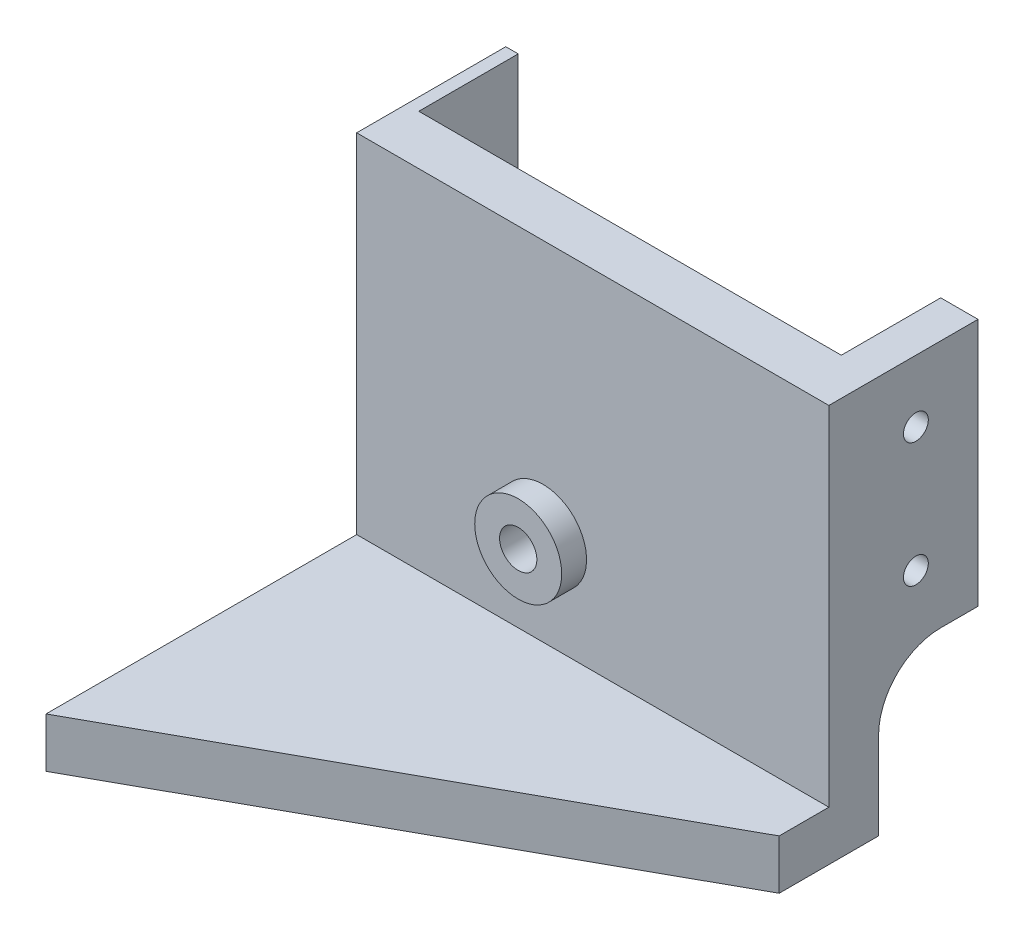
ISO-10303-21;
HEADER;
FILE_DESCRIPTION(('STEP AP214'),'2;1');
FILE_NAME('part.step','',(''),(''),'','','');
FILE_SCHEMA(('AUTOMOTIVE_DESIGN { 1 0 10303 214 1 1 1 1 }'));
ENDSEC;
DATA;
#1=APPLICATION_CONTEXT('core data for automotive mechanical design processes');
#2=APPLICATION_PROTOCOL_DEFINITION('international standard','automotive_design',2000,#1);
#3=PRODUCT_CONTEXT('',#1,'mechanical');
#4=PRODUCT('Part','Part','',(#3));
#5=PRODUCT_RELATED_PRODUCT_CATEGORY('part','',(#4));
#6=PRODUCT_DEFINITION_FORMATION('','',#4);
#7=PRODUCT_DEFINITION_CONTEXT('part definition',#1,'design');
#8=PRODUCT_DEFINITION('design','',#6,#7);
#9=PRODUCT_DEFINITION_SHAPE('','',#8);
#10=(LENGTH_UNIT() NAMED_UNIT(*) SI_UNIT(.MILLI.,.METRE.));
#11=(NAMED_UNIT(*) PLANE_ANGLE_UNIT() SI_UNIT($,.RADIAN.));
#12=(NAMED_UNIT(*) SI_UNIT($,.STERADIAN.) SOLID_ANGLE_UNIT());
#13=UNCERTAINTY_MEASURE_WITH_UNIT(LENGTH_MEASURE(1.E-05),#10,'distance_accuracy_value','');
#14=(GEOMETRIC_REPRESENTATION_CONTEXT(3) GLOBAL_UNCERTAINTY_ASSIGNED_CONTEXT((#13)) GLOBAL_UNIT_ASSIGNED_CONTEXT((#10,
#11,#12)) REPRESENTATION_CONTEXT('',''));
#15=CARTESIAN_POINT('',(0.,0.,0.));
#16=DIRECTION('',(0.,0.,1.));
#17=DIRECTION('',(1.,0.,0.));
#18=AXIS2_PLACEMENT_3D('',#15,#16,#17);
#19=CARTESIAN_POINT('',(0.,0.,0.));
#20=DIRECTION('',(0.,1.,0.));
#21=DIRECTION('',(0.,0.,1.));
#22=AXIS2_PLACEMENT_3D('',#19,#20,#21);
#23=PLANE('',#22);
#24=DIRECTION('',(0.,0.,1.));
#25=VECTOR('',#24,1.);
#26=CARTESIAN_POINT('',(1.,0.,0.));
#27=LINE('',#26,#25);
#28=CARTESIAN_POINT('',(1.,0.,-12.));
#29=VERTEX_POINT('',#28);
#30=CARTESIAN_POINT('',(1.,0.,-9.));
#31=VERTEX_POINT('',#30);
#32=EDGE_CURVE('E228',#29,#31,#27,.T.);
#33=ORIENTED_EDGE('',*,*,#32,.T.);
#34=DIRECTION('',(1.,0.,0.));
#35=VECTOR('',#34,1.);
#36=CARTESIAN_POINT('',(0.,0.,-9.));
#37=LINE('',#36,#35);
#38=CARTESIAN_POINT('',(0.,0.,-9.));
#39=VERTEX_POINT('',#38);
#40=EDGE_CURVE('E270',#31,#39,#37,.F.);
#41=ORIENTED_EDGE('',*,*,#40,.T.);
#42=DIRECTION('',(0.,0.,-1.));
#43=VECTOR('',#42,1.);
#44=CARTESIAN_POINT('',(0.,0.,0.));
#45=LINE('',#44,#43);
#46=CARTESIAN_POINT('',(0.,0.,-12.));
#47=VERTEX_POINT('',#46);
#48=EDGE_CURVE('E232',#39,#47,#45,.T.);
#49=ORIENTED_EDGE('',*,*,#48,.T.);
#50=DIRECTION('',(1.,0.,0.));
#51=VECTOR('',#50,1.);
#52=CARTESIAN_POINT('',(0.,0.,-12.));
#53=LINE('',#52,#51);
#54=EDGE_CURVE('E224',#47,#29,#53,.T.);
#55=ORIENTED_EDGE('',*,*,#54,.T.);
#56=EDGE_LOOP('',(#33,#41,#49,#55));
#57=FACE_BOUND('',#56,.T.);
#58=ADVANCED_FACE('F41',(#57),#23,.F.);
#59=DIRECTION('',(0.,0.,-1.));
#60=VECTOR('',#59,1.);
#61=CARTESIAN_POINT('',(38.,0.,0.));
#62=LINE('',#61,#60);
#63=CARTESIAN_POINT('',(38.,0.,-9.));
#64=VERTEX_POINT('',#63);
#65=CARTESIAN_POINT('',(38.,0.,-12.));
#66=VERTEX_POINT('',#65);
#67=EDGE_CURVE('E197',#64,#66,#62,.T.);
#68=ORIENTED_EDGE('',*,*,#67,.F.);
#69=DIRECTION('',(1.,0.,0.));
#70=VECTOR('',#69,1.);
#71=CARTESIAN_POINT('',(0.,0.,-9.));
#72=LINE('',#71,#70);
#73=CARTESIAN_POINT('',(35.,0.,-9.));
#74=VERTEX_POINT('',#73);
#75=EDGE_CURVE('E273',#64,#74,#72,.F.);
#76=ORIENTED_EDGE('',*,*,#75,.T.);
#77=DIRECTION('',(0.,0.,1.));
#78=VECTOR('',#77,1.);
#79=CARTESIAN_POINT('',(35.,0.,0.));
#80=LINE('',#79,#78);
#81=CARTESIAN_POINT('',(35.,0.,-12.));
#82=VERTEX_POINT('',#81);
#83=EDGE_CURVE('E223',#82,#74,#80,.T.);
#84=ORIENTED_EDGE('',*,*,#83,.F.);
#85=EDGE_CURVE('E191',#82,#66,#53,.T.);
#86=ORIENTED_EDGE('',*,*,#85,.T.);
#87=EDGE_LOOP('',(#68,#76,#84,#86));
#88=FACE_BOUND('',#87,.T.);
#89=ADVANCED_FACE('F336',(#88),#23,.F.);
#90=CARTESIAN_POINT('',(0.,20.,-12.));
#91=DIRECTION('',(0.,0.,-1.));
#92=DIRECTION('',(-1.,0.,0.));
#93=AXIS2_PLACEMENT_3D('',#90,#91,#92);
#94=PLANE('',#93);
#95=ORIENTED_EDGE('',*,*,#85,.F.);
#96=DIRECTION('',(0.,-1.,0.));
#97=VECTOR('',#96,1.);
#98=CARTESIAN_POINT('',(35.,20.,-12.));
#99=LINE('',#98,#97);
#100=CARTESIAN_POINT('',(35.,20.,-12.));
#101=VERTEX_POINT('',#100);
#102=EDGE_CURVE('E259',#101,#82,#99,.T.);
#103=ORIENTED_EDGE('',*,*,#102,.F.);
#104=DIRECTION('',(1.,0.,0.));
#105=VECTOR('',#104,1.);
#106=CARTESIAN_POINT('',(0.,20.,-12.));
#107=LINE('',#106,#105);
#108=CARTESIAN_POINT('',(38.,20.,-12.));
#109=VERTEX_POINT('',#108);
#110=EDGE_CURVE('E192',#101,#109,#107,.T.);
#111=ORIENTED_EDGE('',*,*,#110,.T.);
#112=DIRECTION('',(0.,-1.,0.));
#113=VECTOR('',#112,1.);
#114=CARTESIAN_POINT('',(38.,20.,-12.));
#115=LINE('',#114,#113);
#116=EDGE_CURVE('E219',#109,#66,#115,.T.);
#117=ORIENTED_EDGE('',*,*,#116,.T.);
#118=EDGE_LOOP('',(#95,#103,#111,#117));
#119=FACE_BOUND('',#118,.T.);
#120=ADVANCED_FACE('F334',(#119),#94,.T.);
#121=CARTESIAN_POINT('',(35.,20.,0.));
#122=DIRECTION('',(1.,0.,0.));
#123=DIRECTION('',(0.,0.,-1.));
#124=AXIS2_PLACEMENT_3D('',#121,#122,#123);
#125=PLANE('',#124);
#126=CARTESIAN_POINT('',(35.,15.,-7.));
#127=DIRECTION('',(1.,0.,0.));
#128=DIRECTION('',(0.,0.,-1.));
#129=AXIS2_PLACEMENT_3D('',#126,#127,#128);
#130=CIRCLE('',#129,1.);
#131=CARTESIAN_POINT('',(35.,15.,-8.));
#132=VERTEX_POINT('',#131);
#133=EDGE_CURVE('E158',#132,#132,#130,.T.);
#134=ORIENTED_EDGE('',*,*,#133,.T.);
#135=EDGE_LOOP('',(#134));
#136=FACE_BOUND('',#135,.T.);
#137=CARTESIAN_POINT('',(35.,5.,-7.));
#138=DIRECTION('',(1.,0.,0.));
#139=DIRECTION('',(0.,0.,-1.));
#140=AXIS2_PLACEMENT_3D('',#137,#138,#139);
#141=CIRCLE('',#140,1.);
#142=CARTESIAN_POINT('',(35.,5.,-8.));
#143=VERTEX_POINT('',#142);
#144=EDGE_CURVE('E448',#143,#143,#141,.T.);
#145=ORIENTED_EDGE('',*,*,#144,.T.);
#146=EDGE_LOOP('',(#145));
#147=FACE_BOUND('',#146,.T.);
#148=ORIENTED_EDGE('',*,*,#83,.T.);
#149=CARTESIAN_POINT('',(35.,-5.,-9.));
#150=DIRECTION('',(1.,0.,0.));
#151=DIRECTION('',(0.,0.,-1.));
#152=AXIS2_PLACEMENT_3D('',#149,#150,#151);
#153=CIRCLE('',#152,5.);
#154=CARTESIAN_POINT('',(35.,-5.,-4.));
#155=VERTEX_POINT('',#154);
#156=EDGE_CURVE('E50',#74,#155,#153,.T.);
#157=ORIENTED_EDGE('',*,*,#156,.T.);
#158=DIRECTION('',(0.,-1.,0.));
#159=VECTOR('',#158,1.);
#160=CARTESIAN_POINT('',(35.,20.,-4.));
#161=LINE('',#160,#159);
#162=CARTESIAN_POINT('',(35.,20.,-4.));
#163=VERTEX_POINT('',#162);
#164=EDGE_CURVE('E256',#163,#155,#161,.T.);
#165=ORIENTED_EDGE('',*,*,#164,.F.);
#166=DIRECTION('',(0.,0.,1.));
#167=VECTOR('',#166,1.);
#168=CARTESIAN_POINT('',(35.,20.,0.));
#169=LINE('',#168,#167);
#170=EDGE_CURVE('E196',#101,#163,#169,.T.);
#171=ORIENTED_EDGE('',*,*,#170,.F.);
#172=ORIENTED_EDGE('',*,*,#102,.T.);
#173=EDGE_LOOP('',(#148,#157,#165,#171,#172));
#174=FACE_BOUND('',#173,.T.);
#175=ADVANCED_FACE('F289',(#136,#147,#174),#125,.F.);
#176=CARTESIAN_POINT('',(0.,20.,-4.));
#177=DIRECTION('',(0.,0.,-1.));
#178=DIRECTION('',(-1.,0.,0.));
#179=AXIS2_PLACEMENT_3D('',#176,#177,#178);
#180=PLANE('',#179);
#181=CARTESIAN_POINT('',(15.,-0.5,-4.));
#182=DIRECTION('',(0.,0.,-1.));
#183=DIRECTION('',(-1.,0.,0.));
#184=AXIS2_PLACEMENT_3D('',#181,#182,#183);
#185=CIRCLE('',#184,1.5);
#186=CARTESIAN_POINT('',(13.5,-0.5,-4.));
#187=VERTEX_POINT('',#186);
#188=EDGE_CURVE('E425',#187,#187,#185,.T.);
#189=ORIENTED_EDGE('',*,*,#188,.F.);
#190=EDGE_LOOP('',(#189));
#191=FACE_BOUND('',#190,.T.);
#192=DIRECTION('',(0.,1.,0.));
#193=VECTOR('',#192,1.);
#194=CARTESIAN_POINT('',(0.,-12.,-4.));
#195=LINE('',#194,#193);
#196=CARTESIAN_POINT('',(0.,-12.,-4.));
#197=VERTEX_POINT('',#196);
#198=CARTESIAN_POINT('',(0.,-5.,-4.));
#199=VERTEX_POINT('',#198);
#200=EDGE_CURVE('E187',#197,#199,#195,.T.);
#201=ORIENTED_EDGE('',*,*,#200,.T.);
#202=DIRECTION('',(1.,0.,0.));
#203=VECTOR('',#202,1.);
#204=CARTESIAN_POINT('',(0.,-5.,-4.));
#205=LINE('',#204,#203);
#206=CARTESIAN_POINT('',(1.,-5.,-4.));
#207=VERTEX_POINT('',#206);
#208=EDGE_CURVE('E266',#199,#207,#205,.T.);
#209=ORIENTED_EDGE('',*,*,#208,.T.);
#210=DIRECTION('',(0.,-1.,0.));
#211=VECTOR('',#210,1.);
#212=CARTESIAN_POINT('',(1.,20.,-4.));
#213=LINE('',#212,#211);
#214=CARTESIAN_POINT('',(1.,20.,-4.));
#215=VERTEX_POINT('',#214);
#216=EDGE_CURVE('E253',#215,#207,#213,.T.);
#217=ORIENTED_EDGE('',*,*,#216,.F.);
#218=DIRECTION('',(1.,0.,0.));
#219=VECTOR('',#218,1.);
#220=CARTESIAN_POINT('',(0.,20.,-4.));
#221=LINE('',#220,#219);
#222=EDGE_CURVE('E201',#215,#163,#221,.T.);
#223=ORIENTED_EDGE('',*,*,#222,.T.);
#224=ORIENTED_EDGE('',*,*,#164,.T.);
#225=DIRECTION('',(1.,0.,0.));
#226=VECTOR('',#225,1.);
#227=CARTESIAN_POINT('',(0.,-5.,-4.));
#228=LINE('',#227,#226);
#229=CARTESIAN_POINT('',(38.,-5.,-4.));
#230=VERTEX_POINT('',#229);
#231=EDGE_CURVE('E262',#155,#230,#228,.T.);
#232=ORIENTED_EDGE('',*,*,#231,.T.);
#233=DIRECTION('',(0.,1.,0.));
#234=VECTOR('',#233,1.);
#235=CARTESIAN_POINT('',(38.,-12.,-4.));
#236=LINE('',#235,#234);
#237=CARTESIAN_POINT('',(38.,-12.,-4.));
#238=VERTEX_POINT('',#237);
#239=EDGE_CURVE('E184',#238,#230,#236,.T.);
#240=ORIENTED_EDGE('',*,*,#239,.F.);
#241=DIRECTION('',(1.,0.,0.));
#242=VECTOR('',#241,1.);
#243=CARTESIAN_POINT('',(0.,-12.,-4.));
#244=LINE('',#243,#242);
#245=EDGE_CURVE('E171',#197,#238,#244,.T.);
#246=ORIENTED_EDGE('',*,*,#245,.F.);
#247=EDGE_LOOP('',(#201,#209,#217,#223,#224,#232,#240,#246));
#248=FACE_BOUND('',#247,.T.);
#249=ADVANCED_FACE('F296',(#191,#248),#180,.T.);
#250=CARTESIAN_POINT('',(1.,20.,0.));
#251=DIRECTION('',(1.,0.,0.));
#252=DIRECTION('',(0.,0.,-1.));
#253=AXIS2_PLACEMENT_3D('',#250,#251,#252);
#254=PLANE('',#253);
#255=CARTESIAN_POINT('',(1.,15.,-7.));
#256=DIRECTION('',(1.,0.,0.));
#257=DIRECTION('',(0.,0.,-1.));
#258=AXIS2_PLACEMENT_3D('',#255,#256,#257);
#259=CIRCLE('',#258,1.);
#260=CARTESIAN_POINT('',(1.,15.,-8.));
#261=VERTEX_POINT('',#260);
#262=EDGE_CURVE('E416',#261,#261,#259,.T.);
#263=ORIENTED_EDGE('',*,*,#262,.F.);
#264=EDGE_LOOP('',(#263));
#265=FACE_BOUND('',#264,.T.);
#266=CARTESIAN_POINT('',(1.,5.,-7.));
#267=DIRECTION('',(1.,0.,0.));
#268=DIRECTION('',(0.,0.,-1.));
#269=AXIS2_PLACEMENT_3D('',#266,#267,#268);
#270=CIRCLE('',#269,1.);
#271=CARTESIAN_POINT('',(1.,5.,-8.));
#272=VERTEX_POINT('',#271);
#273=EDGE_CURVE('E452',#272,#272,#270,.T.);
#274=ORIENTED_EDGE('',*,*,#273,.F.);
#275=EDGE_LOOP('',(#274));
#276=FACE_BOUND('',#275,.T.);
#277=ORIENTED_EDGE('',*,*,#32,.F.);
#278=DIRECTION('',(0.,-1.,0.));
#279=VECTOR('',#278,1.);
#280=CARTESIAN_POINT('',(1.,20.,-12.));
#281=LINE('',#280,#279);
#282=CARTESIAN_POINT('',(1.,20.,-12.));
#283=VERTEX_POINT('',#282);
#284=EDGE_CURVE('E250',#283,#29,#281,.T.);
#285=ORIENTED_EDGE('',*,*,#284,.F.);
#286=DIRECTION('',(0.,0.,1.));
#287=VECTOR('',#286,1.);
#288=CARTESIAN_POINT('',(1.,20.,0.));
#289=LINE('',#288,#287);
#290=EDGE_CURVE('E205',#283,#215,#289,.T.);
#291=ORIENTED_EDGE('',*,*,#290,.T.);
#292=ORIENTED_EDGE('',*,*,#216,.T.);
#293=CARTESIAN_POINT('',(1.,-5.,-9.));
#294=DIRECTION('',(1.,0.,0.));
#295=DIRECTION('',(0.,0.,-1.));
#296=AXIS2_PLACEMENT_3D('',#293,#294,#295);
#297=CIRCLE('',#296,5.);
#298=EDGE_CURVE('E276',#207,#31,#297,.F.);
#299=ORIENTED_EDGE('',*,*,#298,.T.);
#300=EDGE_LOOP('',(#277,#285,#291,#292,#299));
#301=FACE_BOUND('',#300,.T.);
#302=ADVANCED_FACE('F310',(#265,#276,#301),#254,.T.);
#303=ORIENTED_EDGE('',*,*,#54,.F.);
#304=DIRECTION('',(0.,-1.,0.));
#305=VECTOR('',#304,1.);
#306=CARTESIAN_POINT('',(0.,20.,-12.));
#307=LINE('',#306,#305);
#308=CARTESIAN_POINT('',(0.,20.,-12.));
#309=VERTEX_POINT('',#308);
#310=EDGE_CURVE('E246',#309,#47,#307,.T.);
#311=ORIENTED_EDGE('',*,*,#310,.F.);
#312=EDGE_CURVE('E198',#309,#283,#107,.T.);
#313=ORIENTED_EDGE('',*,*,#312,.T.);
#314=ORIENTED_EDGE('',*,*,#284,.T.);
#315=EDGE_LOOP('',(#303,#311,#313,#314));
#316=FACE_BOUND('',#315,.T.);
#317=ADVANCED_FACE('F320',(#316),#94,.T.);
#318=CARTESIAN_POINT('',(0.,20.,0.));
#319=DIRECTION('',(-1.,0.,0.));
#320=DIRECTION('',(0.,0.,1.));
#321=AXIS2_PLACEMENT_3D('',#318,#319,#320);
#322=PLANE('',#321);
#323=CARTESIAN_POINT('',(0.,15.,-7.));
#324=DIRECTION('',(-1.,0.,0.));
#325=DIRECTION('',(0.,0.,1.));
#326=AXIS2_PLACEMENT_3D('',#323,#324,#325);
#327=CIRCLE('',#326,1.);
#328=CARTESIAN_POINT('',(0.,15.,-6.));
#329=VERTEX_POINT('',#328);
#330=EDGE_CURVE('E419',#329,#329,#327,.T.);
#331=ORIENTED_EDGE('',*,*,#330,.F.);
#332=EDGE_LOOP('',(#331));
#333=FACE_BOUND('',#332,.T.);
#334=CARTESIAN_POINT('',(0.,5.,-7.));
#335=DIRECTION('',(-1.,0.,0.));
#336=DIRECTION('',(0.,0.,1.));
#337=AXIS2_PLACEMENT_3D('',#334,#335,#336);
#338=CIRCLE('',#337,1.);
#339=CARTESIAN_POINT('',(0.,5.,-6.));
#340=VERTEX_POINT('',#339);
#341=EDGE_CURVE('E456',#340,#340,#338,.T.);
#342=ORIENTED_EDGE('',*,*,#341,.F.);
#343=EDGE_LOOP('',(#342));
#344=FACE_BOUND('',#343,.T.);
#345=ORIENTED_EDGE('',*,*,#48,.F.);
#346=CARTESIAN_POINT('',(0.,-5.,-9.));
#347=DIRECTION('',(-1.,0.,0.));
#348=DIRECTION('',(0.,0.,1.));
#349=AXIS2_PLACEMENT_3D('',#346,#347,#348);
#350=CIRCLE('',#349,5.);
#351=EDGE_CURVE('E279',#39,#199,#350,.F.);
#352=ORIENTED_EDGE('',*,*,#351,.T.);
#353=ORIENTED_EDGE('',*,*,#200,.F.);
#354=DIRECTION('',(0.,0.,-1.));
#355=VECTOR('',#354,1.);
#356=CARTESIAN_POINT('',(0.,-12.,0.));
#357=LINE('',#356,#355);
#358=CARTESIAN_POINT('',(0.,-12.,25.));
#359=VERTEX_POINT('',#358);
#360=EDGE_CURVE('E166',#359,#197,#357,.T.);
#361=ORIENTED_EDGE('',*,*,#360,.F.);
#362=DIRECTION('',(0.,1.,0.));
#363=VECTOR('',#362,1.);
#364=CARTESIAN_POINT('',(0.,-12.,25.));
#365=LINE('',#364,#363);
#366=CARTESIAN_POINT('',(0.,-8.,25.));
#367=VERTEX_POINT('',#366);
#368=EDGE_CURVE('E173',#359,#367,#365,.T.);
#369=ORIENTED_EDGE('',*,*,#368,.T.);
#370=DIRECTION('',(0.,0.,-1.));
#371=VECTOR('',#370,1.);
#372=CARTESIAN_POINT('',(0.,-8.,25.));
#373=LINE('',#372,#371);
#374=CARTESIAN_POINT('',(0.,-8.,0.));
#375=VERTEX_POINT('',#374);
#376=EDGE_CURVE('E155',#367,#375,#373,.T.);
#377=ORIENTED_EDGE('',*,*,#376,.T.);
#378=DIRECTION('',(0.,-1.,0.));
#379=VECTOR('',#378,1.);
#380=CARTESIAN_POINT('',(0.,20.,0.));
#381=LINE('',#380,#379);
#382=CARTESIAN_POINT('',(0.,20.,0.));
#383=VERTEX_POINT('',#382);
#384=EDGE_CURVE('E242',#383,#375,#381,.T.);
#385=ORIENTED_EDGE('',*,*,#384,.F.);
#386=DIRECTION('',(0.,0.,-1.));
#387=VECTOR('',#386,1.);
#388=CARTESIAN_POINT('',(0.,20.,0.));
#389=LINE('',#388,#387);
#390=EDGE_CURVE('E209',#383,#309,#389,.T.);
#391=ORIENTED_EDGE('',*,*,#390,.T.);
#392=ORIENTED_EDGE('',*,*,#310,.T.);
#393=EDGE_LOOP('',(#345,#352,#353,#361,#369,#377,#385,#391,#392));
#394=FACE_BOUND('',#393,.T.);
#395=ADVANCED_FACE('F327',(#333,#344,#394),#322,.T.);
#396=CARTESIAN_POINT('',(0.,20.,0.));
#397=DIRECTION('',(0.,0.,-1.));
#398=DIRECTION('',(-1.,0.,0.));
#399=AXIS2_PLACEMENT_3D('',#396,#397,#398);
#400=PLANE('',#399);
#401=CARTESIAN_POINT('',(15.,-0.5,0.));
#402=DIRECTION('',(0.,0.,-1.));
#403=DIRECTION('',(-1.,0.,0.));
#404=AXIS2_PLACEMENT_3D('',#401,#402,#403);
#405=CIRCLE('',#404,3.5);
#406=CARTESIAN_POINT('',(11.5,-0.5,0.));
#407=VERTEX_POINT('',#406);
#408=EDGE_CURVE('E11',#407,#407,#405,.F.);
#409=ORIENTED_EDGE('',*,*,#408,.F.);
#410=EDGE_LOOP('',(#409));
#411=FACE_BOUND('',#410,.T.);
#412=ORIENTED_EDGE('',*,*,#384,.T.);
#413=DIRECTION('',(1.,0.,0.));
#414=VECTOR('',#413,1.);
#415=CARTESIAN_POINT('',(0.,-8.,0.));
#416=LINE('',#415,#414);
#417=CARTESIAN_POINT('',(38.,-8.,0.));
#418=VERTEX_POINT('',#417);
#419=EDGE_CURVE('E176',#375,#418,#416,.T.);
#420=ORIENTED_EDGE('',*,*,#419,.T.);
#421=DIRECTION('',(0.,-1.,0.));
#422=VECTOR('',#421,1.);
#423=CARTESIAN_POINT('',(38.,20.,0.));
#424=LINE('',#423,#422);
#425=CARTESIAN_POINT('',(38.,20.,0.));
#426=VERTEX_POINT('',#425);
#427=EDGE_CURVE('E164',#426,#418,#424,.T.);
#428=ORIENTED_EDGE('',*,*,#427,.F.);
#429=DIRECTION('',(1.,0.,0.));
#430=VECTOR('',#429,1.);
#431=CARTESIAN_POINT('',(0.,20.,0.));
#432=LINE('',#431,#430);
#433=EDGE_CURVE('E213',#383,#426,#432,.T.);
#434=ORIENTED_EDGE('',*,*,#433,.F.);
#435=EDGE_LOOP('',(#412,#420,#428,#434));
#436=FACE_BOUND('',#435,.T.);
#437=ADVANCED_FACE('F330',(#411,#436),#400,.F.);
#438=CARTESIAN_POINT('',(38.,20.,0.));
#439=DIRECTION('',(-1.,0.,0.));
#440=DIRECTION('',(0.,0.,1.));
#441=AXIS2_PLACEMENT_3D('',#438,#439,#440);
#442=PLANE('',#441);
#443=CARTESIAN_POINT('',(38.,15.,-7.));
#444=DIRECTION('',(-1.,0.,0.));
#445=DIRECTION('',(0.,0.,1.));
#446=AXIS2_PLACEMENT_3D('',#443,#444,#445);
#447=CIRCLE('',#446,1.);
#448=CARTESIAN_POINT('',(38.,15.,-6.));
#449=VERTEX_POINT('',#448);
#450=EDGE_CURVE('E412',#449,#449,#447,.T.);
#451=ORIENTED_EDGE('',*,*,#450,.T.);
#452=EDGE_LOOP('',(#451));
#453=FACE_BOUND('',#452,.T.);
#454=CARTESIAN_POINT('',(38.,5.,-7.));
#455=DIRECTION('',(-1.,0.,0.));
#456=DIRECTION('',(0.,0.,1.));
#457=AXIS2_PLACEMENT_3D('',#454,#455,#456);
#458=CIRCLE('',#457,1.);
#459=CARTESIAN_POINT('',(38.,5.,-6.));
#460=VERTEX_POINT('',#459);
#461=EDGE_CURVE('E460',#460,#460,#458,.T.);
#462=ORIENTED_EDGE('',*,*,#461,.T.);
#463=EDGE_LOOP('',(#462));
#464=FACE_BOUND('',#463,.T.);
#465=DIRECTION('',(0.,0.,-1.));
#466=VECTOR('',#465,1.);
#467=CARTESIAN_POINT('',(38.,-8.,25.));
#468=LINE('',#467,#466);
#469=CARTESIAN_POINT('',(38.,-8.,4.));
#470=VERTEX_POINT('',#469);
#471=EDGE_CURVE('E57',#470,#418,#468,.T.);
#472=ORIENTED_EDGE('',*,*,#471,.F.);
#473=DIRECTION('',(0.,1.,0.));
#474=VECTOR('',#473,1.);
#475=CARTESIAN_POINT('',(38.,-18.,4.));
#476=LINE('',#475,#474);
#477=CARTESIAN_POINT('',(38.,-12.,4.));
#478=VERTEX_POINT('',#477);
#479=EDGE_CURVE('E144',#478,#470,#476,.T.);
#480=ORIENTED_EDGE('',*,*,#479,.F.);
#481=DIRECTION('',(0.,0.,1.));
#482=VECTOR('',#481,1.);
#483=CARTESIAN_POINT('',(38.,-12.,0.));
#484=LINE('',#483,#482);
#485=EDGE_CURVE('E181',#238,#478,#484,.T.);
#486=ORIENTED_EDGE('',*,*,#485,.F.);
#487=ORIENTED_EDGE('',*,*,#239,.T.);
#488=CARTESIAN_POINT('',(38.,-5.,-9.));
#489=DIRECTION('',(-1.,0.,0.));
#490=DIRECTION('',(0.,0.,1.));
#491=AXIS2_PLACEMENT_3D('',#488,#489,#490);
#492=CIRCLE('',#491,5.);
#493=EDGE_CURVE('E65',#230,#64,#492,.T.);
#494=ORIENTED_EDGE('',*,*,#493,.T.);
#495=ORIENTED_EDGE('',*,*,#67,.T.);
#496=ORIENTED_EDGE('',*,*,#116,.F.);
#497=DIRECTION('',(0.,0.,-1.));
#498=VECTOR('',#497,1.);
#499=CARTESIAN_POINT('',(38.,20.,0.));
#500=LINE('',#499,#498);
#501=EDGE_CURVE('E216',#426,#109,#500,.T.);
#502=ORIENTED_EDGE('',*,*,#501,.F.);
#503=ORIENTED_EDGE('',*,*,#427,.T.);
#504=EDGE_LOOP('',(#472,#480,#486,#487,#494,#495,#496,#502,#503));
#505=FACE_BOUND('',#504,.T.);
#506=ADVANCED_FACE('F161',(#453,#464,#505),#442,.F.);
#507=CARTESIAN_POINT('',(0.,20.,0.));
#508=DIRECTION('',(0.,1.,0.));
#509=DIRECTION('',(0.,0.,1.));
#510=AXIS2_PLACEMENT_3D('',#507,#508,#509);
#511=PLANE('',#510);
#512=ORIENTED_EDGE('',*,*,#110,.F.);
#513=ORIENTED_EDGE('',*,*,#170,.T.);
#514=ORIENTED_EDGE('',*,*,#222,.F.);
#515=ORIENTED_EDGE('',*,*,#290,.F.);
#516=ORIENTED_EDGE('',*,*,#312,.F.);
#517=ORIENTED_EDGE('',*,*,#390,.F.);
#518=ORIENTED_EDGE('',*,*,#433,.T.);
#519=ORIENTED_EDGE('',*,*,#501,.T.);
#520=EDGE_LOOP('',(#512,#513,#514,#515,#516,#517,#518,#519));
#521=FACE_BOUND('',#520,.T.);
#522=ADVANCED_FACE('F325',(#521),#511,.T.);
#523=CARTESIAN_POINT('',(0.,-12.,0.));
#524=DIRECTION('',(0.,-1.,0.));
#525=DIRECTION('',(0.,0.,-1.));
#526=AXIS2_PLACEMENT_3D('',#523,#524,#525);
#527=PLANE('',#526);
#528=DIRECTION('',(0.87524153543927,0.,-0.483686111690123));
#529=VECTOR('',#528,1.);
#530=CARTESIAN_POINT('',(10.5835543766578,-12.,19.1511936339523));
#531=LINE('',#530,#529);
#532=EDGE_CURVE('E149',#359,#478,#531,.T.);
#533=ORIENTED_EDGE('',*,*,#532,.F.);
#534=ORIENTED_EDGE('',*,*,#360,.T.);
#535=ORIENTED_EDGE('',*,*,#245,.T.);
#536=ORIENTED_EDGE('',*,*,#485,.T.);
#537=EDGE_LOOP('',(#533,#534,#535,#536));
#538=FACE_BOUND('',#537,.T.);
#539=ADVANCED_FACE('F298',(#538),#527,.T.);
#540=CARTESIAN_POINT('',(0.,-5.,-9.));
#541=DIRECTION('',(1.,0.,0.));
#542=DIRECTION('',(0.,0.,-1.));
#543=AXIS2_PLACEMENT_3D('',#540,#541,#542);
#544=CYLINDRICAL_SURFACE('',#543,5.);
#545=ORIENTED_EDGE('',*,*,#351,.F.);
#546=ORIENTED_EDGE('',*,*,#40,.F.);
#547=ORIENTED_EDGE('',*,*,#298,.F.);
#548=ORIENTED_EDGE('',*,*,#208,.F.);
#549=EDGE_LOOP('',(#545,#546,#547,#548));
#550=FACE_BOUND('',#549,.T.);
#551=ADVANCED_FACE('F306',(#550),#544,.F.);
#552=CARTESIAN_POINT('',(0.,-5.,-9.));
#553=DIRECTION('',(1.,0.,0.));
#554=DIRECTION('',(0.,0.,-1.));
#555=AXIS2_PLACEMENT_3D('',#552,#553,#554);
#556=CYLINDRICAL_SURFACE('',#555,5.);
#557=ORIENTED_EDGE('',*,*,#156,.F.);
#558=ORIENTED_EDGE('',*,*,#75,.F.);
#559=ORIENTED_EDGE('',*,*,#493,.F.);
#560=ORIENTED_EDGE('',*,*,#231,.F.);
#561=EDGE_LOOP('',(#557,#558,#559,#560));
#562=FACE_BOUND('',#561,.T.);
#563=ADVANCED_FACE('F43',(#562),#556,.F.);
#564=CARTESIAN_POINT('',(0.,-8.,25.));
#565=DIRECTION('',(0.,1.,0.));
#566=DIRECTION('',(0.,0.,1.));
#567=AXIS2_PLACEMENT_3D('',#564,#565,#566);
#568=PLANE('',#567);
#569=DIRECTION('',(-0.87524153543927,0.,0.483686111690123));
#570=VECTOR('',#569,1.);
#571=CARTESIAN_POINT('',(0.,-8.,25.));
#572=LINE('',#571,#570);
#573=EDGE_CURVE('E146',#470,#367,#572,.T.);
#574=ORIENTED_EDGE('',*,*,#573,.F.);
#575=ORIENTED_EDGE('',*,*,#471,.T.);
#576=ORIENTED_EDGE('',*,*,#419,.F.);
#577=ORIENTED_EDGE('',*,*,#376,.F.);
#578=EDGE_LOOP('',(#574,#575,#576,#577));
#579=FACE_BOUND('',#578,.T.);
#580=ADVANCED_FACE('F154',(#579),#568,.T.);
#581=CARTESIAN_POINT('',(15.,-0.5,2.));
#582=DIRECTION('',(0.,0.,1.));
#583=DIRECTION('',(1.,0.,0.));
#584=AXIS2_PLACEMENT_3D('',#581,#582,#583);
#585=PLANE('',#584);
#586=CARTESIAN_POINT('',(15.,-0.5,2.));
#587=DIRECTION('',(0.,0.,1.));
#588=DIRECTION('',(1.,0.,0.));
#589=AXIS2_PLACEMENT_3D('',#586,#587,#588);
#590=CIRCLE('',#589,3.5);
#591=CARTESIAN_POINT('',(18.5,-0.5,2.));
#592=VERTEX_POINT('',#591);
#593=EDGE_CURVE('E433',#592,#592,#590,.T.);
#594=ORIENTED_EDGE('',*,*,#593,.T.);
#595=EDGE_LOOP('',(#594));
#596=FACE_BOUND('',#595,.T.);
#597=CARTESIAN_POINT('',(15.,-0.5,2.));
#598=DIRECTION('',(0.,0.,1.));
#599=DIRECTION('',(1.,0.,0.));
#600=AXIS2_PLACEMENT_3D('',#597,#598,#599);
#601=CIRCLE('',#600,1.5);
#602=CARTESIAN_POINT('',(16.5,-0.5,2.));
#603=VERTEX_POINT('',#602);
#604=EDGE_CURVE('E429',#603,#603,#601,.T.);
#605=ORIENTED_EDGE('',*,*,#604,.F.);
#606=EDGE_LOOP('',(#605));
#607=FACE_BOUND('',#606,.T.);
#608=ADVANCED_FACE('F376',(#596,#607),#585,.T.);
#609=CARTESIAN_POINT('',(15.,-0.5,2.));
#610=DIRECTION('',(0.,0.,-1.));
#611=DIRECTION('',(-1.,0.,0.));
#612=AXIS2_PLACEMENT_3D('',#609,#610,#611);
#613=CYLINDRICAL_SURFACE('',#612,3.5);
#614=ORIENTED_EDGE('',*,*,#593,.F.);
#615=EDGE_LOOP('',(#614));
#616=FACE_BOUND('',#615,.T.);
#617=ORIENTED_EDGE('',*,*,#408,.T.);
#618=EDGE_LOOP('',(#617));
#619=FACE_BOUND('',#618,.T.);
#620=ADVANCED_FACE('F377',(#616,#619),#613,.T.);
#621=CARTESIAN_POINT('',(15.,-0.5,2.));
#622=DIRECTION('',(0.,0.,-1.));
#623=DIRECTION('',(-1.,0.,0.));
#624=AXIS2_PLACEMENT_3D('',#621,#622,#623);
#625=CYLINDRICAL_SURFACE('',#624,1.5);
#626=ORIENTED_EDGE('',*,*,#604,.T.);
#627=EDGE_LOOP('',(#626));
#628=FACE_BOUND('',#627,.T.);
#629=ORIENTED_EDGE('',*,*,#188,.T.);
#630=EDGE_LOOP('',(#629));
#631=FACE_BOUND('',#630,.T.);
#632=ADVANCED_FACE('F380',(#628,#631),#625,.F.);
#633=CARTESIAN_POINT('',(0.,-18.,25.));
#634=DIRECTION('',(-0.483686111690123,0.,-0.87524153543927));
#635=DIRECTION('',(-0.87524153543927,0.,0.483686111690123));
#636=AXIS2_PLACEMENT_3D('',#633,#634,#635);
#637=PLANE('',#636);
#638=ORIENTED_EDGE('',*,*,#532,.T.);
#639=ORIENTED_EDGE('',*,*,#479,.T.);
#640=ORIENTED_EDGE('',*,*,#573,.T.);
#641=ORIENTED_EDGE('',*,*,#368,.F.);
#642=EDGE_LOOP('',(#638,#639,#640,#641));
#643=FACE_BOUND('',#642,.T.);
#644=ADVANCED_FACE('F145',(#643),#637,.F.);
#645=CARTESIAN_POINT('',(38.,5.,-7.));
#646=DIRECTION('',(-1.,0.,0.));
#647=DIRECTION('',(0.,0.,1.));
#648=AXIS2_PLACEMENT_3D('',#645,#646,#647);
#649=CYLINDRICAL_SURFACE('',#648,1.);
#650=ORIENTED_EDGE('',*,*,#461,.F.);
#651=EDGE_LOOP('',(#650));
#652=FACE_BOUND('',#651,.T.);
#653=ORIENTED_EDGE('',*,*,#144,.F.);
#654=EDGE_LOOP('',(#653));
#655=FACE_BOUND('',#654,.T.);
#656=ADVANCED_FACE('F390',(#652,#655),#649,.F.);
#657=CARTESIAN_POINT('',(38.,15.,-7.));
#658=DIRECTION('',(-1.,0.,0.));
#659=DIRECTION('',(0.,0.,1.));
#660=AXIS2_PLACEMENT_3D('',#657,#658,#659);
#661=CYLINDRICAL_SURFACE('',#660,1.);
#662=ORIENTED_EDGE('',*,*,#450,.F.);
#663=EDGE_LOOP('',(#662));
#664=FACE_BOUND('',#663,.T.);
#665=ORIENTED_EDGE('',*,*,#133,.F.);
#666=EDGE_LOOP('',(#665));
#667=FACE_BOUND('',#666,.T.);
#668=ADVANCED_FACE('F395',(#664,#667),#661,.F.);
#669=ORIENTED_EDGE('',*,*,#273,.T.);
#670=EDGE_LOOP('',(#669));
#671=FACE_BOUND('',#670,.T.);
#672=ORIENTED_EDGE('',*,*,#341,.T.);
#673=EDGE_LOOP('',(#672));
#674=FACE_BOUND('',#673,.T.);
#675=ADVANCED_FACE('F391',(#671,#674),#649,.F.);
#676=ORIENTED_EDGE('',*,*,#262,.T.);
#677=EDGE_LOOP('',(#676));
#678=FACE_BOUND('',#677,.T.);
#679=ORIENTED_EDGE('',*,*,#330,.T.);
#680=EDGE_LOOP('',(#679));
#681=FACE_BOUND('',#680,.T.);
#682=ADVANCED_FACE('F394',(#678,#681),#661,.F.);
#683=CLOSED_SHELL('',(#58,#89,#120,#175,#249,#302,#317,#395,#437,#506,#522,#539,#551,#563,#580,
#608,#620,#632,#644,#656,#668,#675,#682));
#684=MANIFOLD_SOLID_BREP('B2',#683);
#685=ADVANCED_BREP_SHAPE_REPRESENTATION('',(#18,#684),#14);
#686=SHAPE_DEFINITION_REPRESENTATION(#9,#685);
ENDSEC;
END-ISO-10303-21;
